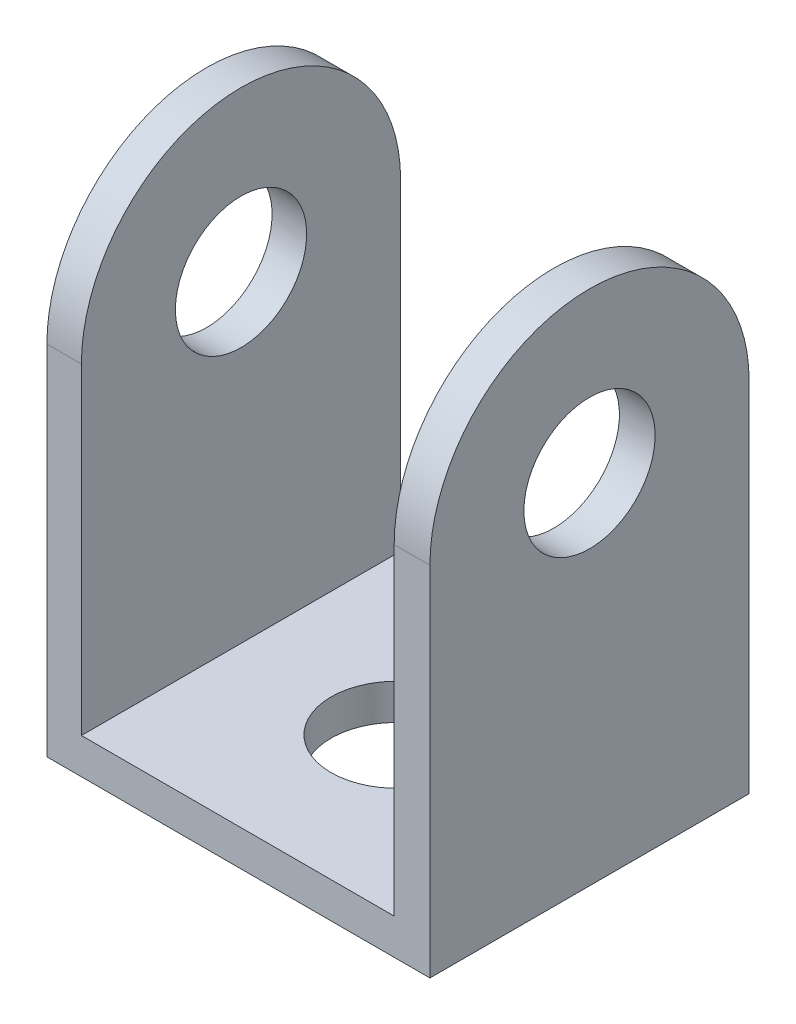
ISO-10303-21;
HEADER;
FILE_DESCRIPTION(('STEP AP214'),'2;1');
FILE_NAME('part.step','',(''),(''),'','','');
FILE_SCHEMA(('AUTOMOTIVE_DESIGN { 1 0 10303 214 1 1 1 1 }'));
ENDSEC;
DATA;
#1=APPLICATION_CONTEXT('core data for automotive mechanical design processes');
#2=APPLICATION_PROTOCOL_DEFINITION('international standard','automotive_design',2000,#1);
#3=PRODUCT_CONTEXT('',#1,'mechanical');
#4=PRODUCT('Part','Part','',(#3));
#5=PRODUCT_RELATED_PRODUCT_CATEGORY('part','',(#4));
#6=PRODUCT_DEFINITION_FORMATION('','',#4);
#7=PRODUCT_DEFINITION_CONTEXT('part definition',#1,'design');
#8=PRODUCT_DEFINITION('design','',#6,#7);
#9=PRODUCT_DEFINITION_SHAPE('','',#8);
#10=(LENGTH_UNIT() NAMED_UNIT(*) SI_UNIT(.MILLI.,.METRE.));
#11=(NAMED_UNIT(*) PLANE_ANGLE_UNIT() SI_UNIT($,.RADIAN.));
#12=(NAMED_UNIT(*) SI_UNIT($,.STERADIAN.) SOLID_ANGLE_UNIT());
#13=UNCERTAINTY_MEASURE_WITH_UNIT(LENGTH_MEASURE(1.E-05),#10,'distance_accuracy_value','');
#14=(GEOMETRIC_REPRESENTATION_CONTEXT(3) GLOBAL_UNCERTAINTY_ASSIGNED_CONTEXT((#13)) GLOBAL_UNIT_ASSIGNED_CONTEXT((#10,
#11,#12)) REPRESENTATION_CONTEXT('',''));
#15=CARTESIAN_POINT('',(0.,0.,0.));
#16=DIRECTION('',(0.,0.,1.));
#17=DIRECTION('',(1.,0.,0.));
#18=AXIS2_PLACEMENT_3D('',#15,#16,#17);
#19=CARTESIAN_POINT('',(19.05,0.,0.));
#20=DIRECTION('',(-1.,0.,0.));
#21=DIRECTION('',(0.,0.,1.));
#22=AXIS2_PLACEMENT_3D('',#19,#20,#21);
#23=CYLINDRICAL_SURFACE('',#22,7.9375);
#24=DIRECTION('',(-1.,0.,0.));
#25=VECTOR('',#24,1.);
#26=CARTESIAN_POINT('',(19.05,0.,-7.9375));
#27=LINE('',#26,#25);
#28=CARTESIAN_POINT('',(19.05,0.,-7.9375));
#29=VERTEX_POINT('',#28);
#30=CARTESIAN_POINT('',(17.272,0.,-7.9375));
#31=VERTEX_POINT('',#30);
#32=EDGE_CURVE('E50',#29,#31,#27,.T.);
#33=ORIENTED_EDGE('',*,*,#32,.T.);
#34=CARTESIAN_POINT('',(17.272,0.,0.));
#35=DIRECTION('',(1.,0.,0.));
#36=DIRECTION('',(0.,0.,-1.));
#37=AXIS2_PLACEMENT_3D('',#34,#35,#36);
#38=CIRCLE('',#37,7.9375);
#39=CARTESIAN_POINT('',(17.272,0.,7.9375));
#40=VERTEX_POINT('',#39);
#41=EDGE_CURVE('E147',#31,#40,#38,.T.);
#42=ORIENTED_EDGE('',*,*,#41,.T.);
#43=DIRECTION('',(-1.,0.,0.));
#44=VECTOR('',#43,1.);
#45=CARTESIAN_POINT('',(19.05,0.,7.9375));
#46=LINE('',#45,#44);
#47=CARTESIAN_POINT('',(19.05,0.,7.9375));
#48=VERTEX_POINT('',#47);
#49=EDGE_CURVE('E175',#48,#40,#46,.T.);
#50=ORIENTED_EDGE('',*,*,#49,.F.);
#51=CARTESIAN_POINT('',(19.05,0.,0.));
#52=DIRECTION('',(1.,0.,0.));
#53=DIRECTION('',(0.,0.,-1.));
#54=AXIS2_PLACEMENT_3D('',#51,#52,#53);
#55=CIRCLE('',#54,7.9375);
#56=EDGE_CURVE('E95',#29,#48,#55,.T.);
#57=ORIENTED_EDGE('',*,*,#56,.F.);
#58=EDGE_LOOP('',(#33,#42,#50,#57));
#59=FACE_BOUND('',#58,.T.);
#60=ADVANCED_FACE('F41',(#59),#23,.T.);
#61=CARTESIAN_POINT('',(19.05,0.,0.));
#62=DIRECTION('',(-1.,0.,0.));
#63=DIRECTION('',(0.,0.,1.));
#64=AXIS2_PLACEMENT_3D('',#61,#62,#63);
#65=CYLINDRICAL_SURFACE('',#64,3.2639);
#66=CARTESIAN_POINT('',(17.272,0.,0.));
#67=DIRECTION('',(1.,0.,0.));
#68=DIRECTION('',(0.,0.,-1.));
#69=AXIS2_PLACEMENT_3D('',#66,#67,#68);
#70=CIRCLE('',#69,3.2639);
#71=CARTESIAN_POINT('',(17.272,0.,3.2639));
#72=VERTEX_POINT('',#71);
#73=EDGE_CURVE('E137',#72,#72,#70,.T.);
#74=CARTESIAN_POINT('',(19.05,0.,0.));
#75=DIRECTION('',(1.,0.,0.));
#76=DIRECTION('',(0.,0.,-1.));
#77=AXIS2_PLACEMENT_3D('',#74,#75,#76);
#78=CIRCLE('',#77,3.2639);
#79=CARTESIAN_POINT('',(19.05,0.,3.2639));
#80=VERTEX_POINT('',#79);
#81=EDGE_CURVE('E158',#80,#80,#78,.T.);
#82=CARTESIAN_POINT('',(17.272,0.,3.2639));
#83=CARTESIAN_POINT('',(17.2905208333333,0.,3.2639));
#84=CARTESIAN_POINT('',(17.3090416666667,0.,3.2639));
#85=CARTESIAN_POINT('',(17.3460833333333,0.,3.2639));
#86=CARTESIAN_POINT('',(17.3646041666667,0.,3.2639));
#87=CARTESIAN_POINT('',(17.4016458333333,0.,3.2639));
#88=CARTESIAN_POINT('',(17.4201666666667,0.,3.2639));
#89=CARTESIAN_POINT('',(17.4572083333333,0.,3.2639));
#90=CARTESIAN_POINT('',(17.4757291666667,0.,3.2639));
#91=CARTESIAN_POINT('',(17.5127708333333,0.,3.2639));
#92=CARTESIAN_POINT('',(17.5312916666667,0.,3.2639));
#93=CARTESIAN_POINT('',(17.5683333333333,0.,3.2639));
#94=CARTESIAN_POINT('',(17.5868541666667,0.,3.2639));
#95=CARTESIAN_POINT('',(17.6238958333333,0.,3.2639));
#96=CARTESIAN_POINT('',(17.6424166666667,0.,3.2639));
#97=CARTESIAN_POINT('',(17.6794583333333,0.,3.2639));
#98=CARTESIAN_POINT('',(17.6979791666667,0.,3.2639));
#99=CARTESIAN_POINT('',(17.7350208333333,0.,3.2639));
#100=CARTESIAN_POINT('',(17.7535416666667,0.,3.2639));
#101=CARTESIAN_POINT('',(17.7905833333333,0.,3.2639));
#102=CARTESIAN_POINT('',(17.8091041666667,0.,3.2639));
#103=CARTESIAN_POINT('',(17.8461458333333,0.,3.2639));
#104=CARTESIAN_POINT('',(17.8646666666667,0.,3.2639));
#105=CARTESIAN_POINT('',(17.9017083333333,0.,3.2639));
#106=CARTESIAN_POINT('',(17.9202291666667,0.,3.2639));
#107=CARTESIAN_POINT('',(17.9572708333333,0.,3.2639));
#108=CARTESIAN_POINT('',(17.9757916666667,0.,3.2639));
#109=CARTESIAN_POINT('',(18.0128333333333,0.,3.2639));
#110=CARTESIAN_POINT('',(18.0313541666667,0.,3.2639));
#111=CARTESIAN_POINT('',(18.0683958333333,0.,3.2639));
#112=CARTESIAN_POINT('',(18.0869166666667,0.,3.2639));
#113=CARTESIAN_POINT('',(18.1239583333333,0.,3.2639));
#114=CARTESIAN_POINT('',(18.1424791666667,0.,3.2639));
#115=CARTESIAN_POINT('',(18.1795208333333,0.,3.2639));
#116=CARTESIAN_POINT('',(18.1980416666667,0.,3.2639));
#117=CARTESIAN_POINT('',(18.2350833333333,0.,3.2639));
#118=CARTESIAN_POINT('',(18.2536041666667,0.,3.2639));
#119=CARTESIAN_POINT('',(18.2906458333333,0.,3.2639));
#120=CARTESIAN_POINT('',(18.3091666666667,0.,3.2639));
#121=CARTESIAN_POINT('',(18.3462083333333,0.,3.2639));
#122=CARTESIAN_POINT('',(18.3647291666667,0.,3.2639));
#123=CARTESIAN_POINT('',(18.4017708333333,0.,3.2639));
#124=CARTESIAN_POINT('',(18.4202916666667,0.,3.2639));
#125=CARTESIAN_POINT('',(18.4573333333333,0.,3.2639));
#126=CARTESIAN_POINT('',(18.4758541666667,0.,3.2639));
#127=CARTESIAN_POINT('',(18.5128958333333,0.,3.2639));
#128=CARTESIAN_POINT('',(18.5314166666667,0.,3.2639));
#129=CARTESIAN_POINT('',(18.5684583333333,0.,3.2639));
#130=CARTESIAN_POINT('',(18.5869791666667,0.,3.2639));
#131=CARTESIAN_POINT('',(18.6240208333333,0.,3.2639));
#132=CARTESIAN_POINT('',(18.6425416666667,0.,3.2639));
#133=CARTESIAN_POINT('',(18.6795833333333,0.,3.2639));
#134=CARTESIAN_POINT('',(18.6981041666667,0.,3.2639));
#135=CARTESIAN_POINT('',(18.7351458333333,0.,3.2639));
#136=CARTESIAN_POINT('',(18.7536666666667,0.,3.2639));
#137=CARTESIAN_POINT('',(18.7907083333333,0.,3.2639));
#138=CARTESIAN_POINT('',(18.8092291666667,0.,3.2639));
#139=CARTESIAN_POINT('',(18.8462708333333,0.,3.2639));
#140=CARTESIAN_POINT('',(18.8647916666667,0.,3.2639));
#141=CARTESIAN_POINT('',(18.9018333333333,0.,3.2639));
#142=CARTESIAN_POINT('',(18.9203541666667,0.,3.2639));
#143=CARTESIAN_POINT('',(18.9573958333333,0.,3.2639));
#144=CARTESIAN_POINT('',(18.9759166666667,0.,3.2639));
#145=CARTESIAN_POINT('',(19.0129583333333,0.,3.2639));
#146=CARTESIAN_POINT('',(19.0314791666667,0.,3.2639));
#147=CARTESIAN_POINT('',(19.05,0.,3.2639));
#148=B_SPLINE_CURVE_WITH_KNOTS('',3,(#82,#83,#84,#85,#86,#87,#88,#89,#90,#91,#92,#93,#94,#95,
#96,#97,#98,#99,#100,#101,#102,#103,#104,#105,#106,#107,#108,#109,#110,#111,#112,#113,#114,#115,
#116,#117,#118,#119,#120,#121,#122,#123,#124,#125,#126,#127,#128,#129,#130,#131,#132,#133,#134,
#135,#136,#137,#138,#139,#140,#141,#142,#143,#144,#145,#146,#147),.UNSPECIFIED.,.F.,.F.,(4,2,2,
2,2,2,2,2,2,2,2,2,2,2,2,2,2,2,2,2,2,2,2,2,2,2,2,2,2,2,2,2,4),(0.,0.0555625000000018,0.111125,
0.166687500000002,0.22225,0.277812500000002,0.333375,0.388937500000002,0.4445,0.500062500000002,
0.555625000000001,0.611187500000002,0.666750000000001,0.722312500000002,0.777875000000001,
0.833437500000003,0.889000000000001,0.944562499999999,1.000125,1.0556875,1.11125,1.1668125,
1.222375,1.2779375,1.3335,1.3890625,1.444625,1.5001875,1.55575,1.6113125,1.666875,1.7224375,
1.778),.UNSPECIFIED.);
#149=EDGE_CURVE('BSEAM206',#72,#80,#148,.T.);
#150=ORIENTED_EDGE('',*,*,#73,.F.);
#151=ORIENTED_EDGE('',*,*,#81,.T.);
#152=ORIENTED_EDGE('',*,*,#149,.T.);
#153=ORIENTED_EDGE('',*,*,#149,.F.);
#154=EDGE_LOOP('',(#150,#152,#151,#153));
#155=FACE_BOUND('',#154,.T.);
#156=ADVANCED_FACE('F206',(#155),#65,.F.);
#157=CARTESIAN_POINT('',(19.05,0.,-7.9375));
#158=DIRECTION('',(0.,0.,1.));
#159=DIRECTION('',(0.,-1.,0.));
#160=AXIS2_PLACEMENT_3D('',#157,#158,#159);
#161=PLANE('',#160);
#162=DIRECTION('',(1.,0.,0.));
#163=VECTOR('',#162,1.);
#164=CARTESIAN_POINT('',(19.05,-16.002,-7.9375));
#165=LINE('',#164,#163);
#166=CARTESIAN_POINT('',(1.71697331779427,-16.002,-7.9375));
#167=VERTEX_POINT('',#166);
#168=CARTESIAN_POINT('',(17.272,-16.002,-7.9375));
#169=VERTEX_POINT('',#168);
#170=EDGE_CURVE('E118',#167,#169,#165,.T.);
#171=ORIENTED_EDGE('',*,*,#170,.T.);
#172=DIRECTION('',(0.,1.,0.));
#173=VECTOR('',#172,1.);
#174=CARTESIAN_POINT('',(17.272,0.,-7.9375));
#175=LINE('',#174,#173);
#176=EDGE_CURVE('E128',#169,#31,#175,.T.);
#177=ORIENTED_EDGE('',*,*,#176,.T.);
#178=ORIENTED_EDGE('',*,*,#32,.F.);
#179=DIRECTION('',(0.,1.,0.));
#180=VECTOR('',#179,1.);
#181=CARTESIAN_POINT('',(19.05,0.,-7.9375));
#182=LINE('',#181,#180);
#183=CARTESIAN_POINT('',(19.05,-17.78,-7.9375));
#184=VERTEX_POINT('',#183);
#185=EDGE_CURVE('E151',#184,#29,#182,.T.);
#186=ORIENTED_EDGE('',*,*,#185,.F.);
#187=DIRECTION('',(-1.,0.,0.));
#188=VECTOR('',#187,1.);
#189=CARTESIAN_POINT('',(19.05,-17.78,-7.9375));
#190=LINE('',#189,#188);
#191=CARTESIAN_POINT('',(0.,-17.78,-7.9375));
#192=VERTEX_POINT('',#191);
#193=EDGE_CURVE('E161',#184,#192,#190,.T.);
#194=ORIENTED_EDGE('',*,*,#193,.T.);
#195=DIRECTION('',(0.,1.,0.));
#196=VECTOR('',#195,1.);
#197=CARTESIAN_POINT('',(0.,0.,-7.9375));
#198=LINE('',#197,#196);
#199=CARTESIAN_POINT('',(0.,0.,-7.9375));
#200=VERTEX_POINT('',#199);
#201=EDGE_CURVE('E127',#192,#200,#198,.T.);
#202=ORIENTED_EDGE('',*,*,#201,.T.);
#203=CARTESIAN_POINT('',(1.71697331779427,0.,-7.9375));
#204=VERTEX_POINT('',#203);
#205=EDGE_CURVE('E136',#204,#200,#27,.T.);
#206=ORIENTED_EDGE('',*,*,#205,.F.);
#207=DIRECTION('',(0.,-1.,0.));
#208=VECTOR('',#207,1.);
#209=CARTESIAN_POINT('',(1.71697331779427,0.,-7.9375));
#210=LINE('',#209,#208);
#211=EDGE_CURVE('E131',#204,#167,#210,.T.);
#212=ORIENTED_EDGE('',*,*,#211,.T.);
#213=EDGE_LOOP('',(#171,#177,#178,#186,#194,#202,#206,#212));
#214=FACE_BOUND('',#213,.T.);
#215=ADVANCED_FACE('F43',(#214),#161,.F.);
#216=CARTESIAN_POINT('',(1.71697331779427,0.,7.9375));
#217=VERTEX_POINT('',#216);
#218=CARTESIAN_POINT('',(0.,0.,7.9375));
#219=VERTEX_POINT('',#218);
#220=EDGE_CURVE('E174',#217,#219,#46,.T.);
#221=ORIENTED_EDGE('',*,*,#220,.F.);
#222=CARTESIAN_POINT('',(1.71697331779427,0.,0.));
#223=DIRECTION('',(-1.,0.,0.));
#224=DIRECTION('',(0.,0.,1.));
#225=AXIS2_PLACEMENT_3D('',#222,#223,#224);
#226=CIRCLE('',#225,7.9375);
#227=EDGE_CURVE('E57',#217,#204,#226,.T.);
#228=ORIENTED_EDGE('',*,*,#227,.T.);
#229=ORIENTED_EDGE('',*,*,#205,.T.);
#230=CARTESIAN_POINT('',(0.,0.,0.));
#231=DIRECTION('',(1.,0.,0.));
#232=DIRECTION('',(0.,0.,-1.));
#233=AXIS2_PLACEMENT_3D('',#230,#231,#232);
#234=CIRCLE('',#233,7.9375);
#235=EDGE_CURVE('E163',#200,#219,#234,.T.);
#236=ORIENTED_EDGE('',*,*,#235,.T.);
#237=EDGE_LOOP('',(#221,#228,#229,#236));
#238=FACE_BOUND('',#237,.T.);
#239=ADVANCED_FACE('F207',(#238),#23,.T.);
#240=CARTESIAN_POINT('',(19.05,0.,7.9375));
#241=DIRECTION('',(0.,0.,-1.));
#242=DIRECTION('',(0.,1.,0.));
#243=AXIS2_PLACEMENT_3D('',#240,#241,#242);
#244=PLANE('',#243);
#245=ORIENTED_EDGE('',*,*,#49,.T.);
#246=DIRECTION('',(0.,-1.,0.));
#247=VECTOR('',#246,1.);
#248=CARTESIAN_POINT('',(17.272,0.,7.9375));
#249=LINE('',#248,#247);
#250=CARTESIAN_POINT('',(17.272,-16.002,7.9375));
#251=VERTEX_POINT('',#250);
#252=EDGE_CURVE('E140',#40,#251,#249,.T.);
#253=ORIENTED_EDGE('',*,*,#252,.T.);
#254=DIRECTION('',(-1.,0.,0.));
#255=VECTOR('',#254,1.);
#256=CARTESIAN_POINT('',(19.05,-16.002,7.9375));
#257=LINE('',#256,#255);
#258=CARTESIAN_POINT('',(1.71697331779427,-16.002,7.9375));
#259=VERTEX_POINT('',#258);
#260=EDGE_CURVE('E11',#251,#259,#257,.T.);
#261=ORIENTED_EDGE('',*,*,#260,.T.);
#262=DIRECTION('',(0.,1.,0.));
#263=VECTOR('',#262,1.);
#264=CARTESIAN_POINT('',(1.71697331779427,0.,7.9375));
#265=LINE('',#264,#263);
#266=EDGE_CURVE('E132',#259,#217,#265,.T.);
#267=ORIENTED_EDGE('',*,*,#266,.T.);
#268=ORIENTED_EDGE('',*,*,#220,.T.);
#269=DIRECTION('',(0.,-1.,0.));
#270=VECTOR('',#269,1.);
#271=CARTESIAN_POINT('',(0.,0.,7.9375));
#272=LINE('',#271,#270);
#273=CARTESIAN_POINT('',(0.,-17.78,7.9375));
#274=VERTEX_POINT('',#273);
#275=EDGE_CURVE('E166',#219,#274,#272,.T.);
#276=ORIENTED_EDGE('',*,*,#275,.T.);
#277=DIRECTION('',(-1.,0.,0.));
#278=VECTOR('',#277,1.);
#279=CARTESIAN_POINT('',(19.05,-17.78,7.9375));
#280=LINE('',#279,#278);
#281=CARTESIAN_POINT('',(19.05,-17.78,7.9375));
#282=VERTEX_POINT('',#281);
#283=EDGE_CURVE('E172',#282,#274,#280,.T.);
#284=ORIENTED_EDGE('',*,*,#283,.F.);
#285=DIRECTION('',(0.,-1.,0.));
#286=VECTOR('',#285,1.);
#287=CARTESIAN_POINT('',(19.05,0.,7.9375));
#288=LINE('',#287,#286);
#289=EDGE_CURVE('E155',#48,#282,#288,.T.);
#290=ORIENTED_EDGE('',*,*,#289,.F.);
#291=EDGE_LOOP('',(#245,#253,#261,#267,#268,#276,#284,#290));
#292=FACE_BOUND('',#291,.T.);
#293=ADVANCED_FACE('F217',(#292),#244,.F.);
#294=CARTESIAN_POINT('',(19.05,-17.78,0.));
#295=DIRECTION('',(0.,1.,0.));
#296=DIRECTION('',(0.,0.,1.));
#297=AXIS2_PLACEMENT_3D('',#294,#295,#296);
#298=PLANE('',#297);
#299=CARTESIAN_POINT('',(9.525,-17.78,0.0634999999999993));
#300=DIRECTION('',(0.,1.,0.));
#301=DIRECTION('',(0.,0.,1.));
#302=AXIS2_PLACEMENT_3D('',#299,#300,#301);
#303=CIRCLE('',#302,3.2639);
#304=CARTESIAN_POINT('',(9.525,-17.78,3.3274));
#305=VERTEX_POINT('',#304);
#306=EDGE_CURVE('E186',#305,#305,#303,.T.);
#307=ORIENTED_EDGE('',*,*,#306,.T.);
#308=EDGE_LOOP('',(#307));
#309=FACE_BOUND('',#308,.T.);
#310=DIRECTION('',(0.,0.,-1.));
#311=VECTOR('',#310,1.);
#312=CARTESIAN_POINT('',(0.,-17.78,0.));
#313=LINE('',#312,#311);
#314=EDGE_CURVE('E87',#274,#192,#313,.T.);
#315=ORIENTED_EDGE('',*,*,#314,.T.);
#316=ORIENTED_EDGE('',*,*,#193,.F.);
#317=DIRECTION('',(0.,0.,-1.));
#318=VECTOR('',#317,1.);
#319=CARTESIAN_POINT('',(19.05,-17.78,0.));
#320=LINE('',#319,#318);
#321=EDGE_CURVE('E66',#282,#184,#320,.T.);
#322=ORIENTED_EDGE('',*,*,#321,.F.);
#323=ORIENTED_EDGE('',*,*,#283,.T.);
#324=EDGE_LOOP('',(#315,#316,#322,#323));
#325=FACE_BOUND('',#324,.T.);
#326=ADVANCED_FACE('F223',(#309,#325),#298,.F.);
#327=CARTESIAN_POINT('',(1.71697331779427,0.,0.));
#328=DIRECTION('',(-1.,0.,0.));
#329=DIRECTION('',(0.,0.,1.));
#330=AXIS2_PLACEMENT_3D('',#327,#328,#329);
#331=CIRCLE('',#330,3.2639);
#332=CARTESIAN_POINT('',(1.71697331779427,0.,3.2639));
#333=VERTEX_POINT('',#332);
#334=EDGE_CURVE('E179',#333,#333,#331,.T.);
#335=CARTESIAN_POINT('',(0.,0.,0.));
#336=DIRECTION('',(1.,0.,0.));
#337=DIRECTION('',(0.,0.,-1.));
#338=AXIS2_PLACEMENT_3D('',#335,#336,#337);
#339=CIRCLE('',#338,3.2639);
#340=CARTESIAN_POINT('',(0.,0.,3.2639));
#341=VERTEX_POINT('',#340);
#342=EDGE_CURVE('E153',#341,#341,#339,.T.);
#343=CARTESIAN_POINT('',(1.71697331779427,0.,3.2639));
#344=CARTESIAN_POINT('',(1.69908817906724,0.,3.2639));
#345=CARTESIAN_POINT('',(1.68120304034022,0.,3.2639));
#346=CARTESIAN_POINT('',(1.64543276288617,0.,3.2639));
#347=CARTESIAN_POINT('',(1.62754762415915,0.,3.2639));
#348=CARTESIAN_POINT('',(1.5917773467051,0.,3.2639));
#349=CARTESIAN_POINT('',(1.57389220797808,0.,3.2639));
#350=CARTESIAN_POINT('',(1.53812193052403,0.,3.2639));
#351=CARTESIAN_POINT('',(1.52023679179701,0.,3.2639));
#352=CARTESIAN_POINT('',(1.48446651434296,0.,3.2639));
#353=CARTESIAN_POINT('',(1.46658137561594,0.,3.2639));
#354=CARTESIAN_POINT('',(1.43081109816189,0.,3.2639));
#355=CARTESIAN_POINT('',(1.41292595943487,0.,3.2639));
#356=CARTESIAN_POINT('',(1.37715568198082,0.,3.2639));
#357=CARTESIAN_POINT('',(1.35927054325379,0.,3.2639));
#358=CARTESIAN_POINT('',(1.32350026579975,0.,3.2639));
#359=CARTESIAN_POINT('',(1.30561512707272,0.,3.2639));
#360=CARTESIAN_POINT('',(1.26984484961868,0.,3.2639));
#361=CARTESIAN_POINT('',(1.25195971089165,0.,3.2639));
#362=CARTESIAN_POINT('',(1.21618943343761,0.,3.2639));
#363=CARTESIAN_POINT('',(1.19830429471058,0.,3.2639));
#364=CARTESIAN_POINT('',(1.16253401725653,0.,3.2639));
#365=CARTESIAN_POINT('',(1.14464887852951,0.,3.2639));
#366=CARTESIAN_POINT('',(1.10887860107546,0.,3.2639));
#367=CARTESIAN_POINT('',(1.09099346234844,0.,3.2639));
#368=CARTESIAN_POINT('',(1.05522318489439,0.,3.2639));
#369=CARTESIAN_POINT('',(1.03733804616737,0.,3.2639));
#370=CARTESIAN_POINT('',(1.00156776871332,0.,3.2639));
#371=CARTESIAN_POINT('',(0.983682629986298,0.,3.2639));
#372=CARTESIAN_POINT('',(0.947912352532251,0.,3.2639));
#373=CARTESIAN_POINT('',(0.930027213805228,0.,3.2639));
#374=CARTESIAN_POINT('',(0.894256936351181,0.,3.2639));
#375=CARTESIAN_POINT('',(0.876371797624157,0.,3.2639));
#376=CARTESIAN_POINT('',(0.840601520170109,0.,3.2639));
#377=CARTESIAN_POINT('',(0.822716381443085,0.,3.2639));
#378=CARTESIAN_POINT('',(0.786946103989039,0.,3.2639));
#379=CARTESIAN_POINT('',(0.769060965262016,0.,3.2639));
#380=CARTESIAN_POINT('',(0.733290687807969,0.,3.2639));
#381=CARTESIAN_POINT('',(0.715405549080945,0.,3.2639));
#382=CARTESIAN_POINT('',(0.679635271626897,0.,3.2639));
#383=CARTESIAN_POINT('',(0.661750132899873,0.,3.2639));
#384=CARTESIAN_POINT('',(0.625979855445826,0.,3.2639));
#385=CARTESIAN_POINT('',(0.608094716718804,0.,3.2639));
#386=CARTESIAN_POINT('',(0.572324439264757,0.,3.2639));
#387=CARTESIAN_POINT('',(0.554439300537733,0.,3.2639));
#388=CARTESIAN_POINT('',(0.518669023083685,0.,3.2639));
#389=CARTESIAN_POINT('',(0.500783884356661,0.,3.2639));
#390=CARTESIAN_POINT('',(0.465013606902614,0.,3.2639));
#391=CARTESIAN_POINT('',(0.447128468175591,0.,3.2639));
#392=CARTESIAN_POINT('',(0.411358190721544,0.,3.2639));
#393=CARTESIAN_POINT('',(0.39347305199452,0.,3.2639));
#394=CARTESIAN_POINT('',(0.357702774540473,0.,3.2639));
#395=CARTESIAN_POINT('',(0.339817635813449,0.,3.2639));
#396=CARTESIAN_POINT('',(0.304047358359401,0.,3.2639));
#397=CARTESIAN_POINT('',(0.286162219632377,0.,3.2639));
#398=CARTESIAN_POINT('',(0.25039194217833,0.,3.2639));
#399=CARTESIAN_POINT('',(0.232506803451307,0.,3.2639));
#400=CARTESIAN_POINT('',(0.19673652599726,0.,3.2639));
#401=CARTESIAN_POINT('',(0.178851387270236,0.,3.2639));
#402=CARTESIAN_POINT('',(0.143081109816188,0.,3.2639));
#403=CARTESIAN_POINT('',(0.125195971089164,0.,3.2639));
#404=CARTESIAN_POINT('',(0.0894256936351176,0.,3.2639));
#405=CARTESIAN_POINT('',(0.0715405549080947,0.,3.2639));
#406=CARTESIAN_POINT('',(0.0357702774540479,0.,3.2639));
#407=CARTESIAN_POINT('',(0.017885138727024,0.,3.2639));
#408=CARTESIAN_POINT('',(0.,0.,3.2639));
#409=B_SPLINE_CURVE_WITH_KNOTS('',3,(#343,#344,#345,#346,#347,#348,#349,#350,#351,#352,#353,
#354,#355,#356,#357,#358,#359,#360,#361,#362,#363,#364,#365,#366,#367,#368,#369,#370,#371,#372,
#373,#374,#375,#376,#377,#378,#379,#380,#381,#382,#383,#384,#385,#386,#387,#388,#389,#390,#391,
#392,#393,#394,#395,#396,#397,#398,#399,#400,#401,#402,#403,#404,#405,#406,#407,#408),
.UNSPECIFIED.,.F.,.F.,(4,2,2,2,2,2,2,2,2,2,2,2,2,2,2,2,2,2,2,2,2,2,2,2,2,2,2,2,2,2,2,2,4),(0.,
0.0536554161810719,0.10731083236214,0.160966248543212,0.214621664724284,0.268277080905353,
0.321932497086425,0.375587913267497,0.429243329448568,0.482898745629637,0.536554161810709,
0.590209577991781,0.643864994172849,0.697520410353921,0.751175826534993,0.804831242716061,
0.858486658897133,0.912142075078205,0.965797491259274,1.01945290744035,1.07310832362142,
1.12676373980249,1.18041915598356,1.23407457216463,1.2877299883457,1.34138540452677,
1.39504082070784,1.44869623688891,1.50235165306998,1.55600706925105,1.60966248543213,
1.66331790161319,1.71697331779427),.UNSPECIFIED.);
#410=EDGE_CURVE('BSEAM214',#333,#341,#409,.T.);
#411=ORIENTED_EDGE('',*,*,#334,.F.);
#412=ORIENTED_EDGE('',*,*,#342,.F.);
#413=ORIENTED_EDGE('',*,*,#410,.T.);
#414=ORIENTED_EDGE('',*,*,#410,.F.);
#415=EDGE_LOOP('',(#411,#413,#412,#414));
#416=FACE_BOUND('',#415,.T.);
#417=ADVANCED_FACE('F214',(#416),#65,.F.);
#418=CARTESIAN_POINT('',(19.05,0.,0.));
#419=DIRECTION('',(1.,0.,0.));
#420=DIRECTION('',(0.,0.,-1.));
#421=AXIS2_PLACEMENT_3D('',#418,#419,#420);
#422=PLANE('',#421);
#423=ORIENTED_EDGE('',*,*,#185,.T.);
#424=ORIENTED_EDGE('',*,*,#56,.T.);
#425=ORIENTED_EDGE('',*,*,#289,.T.);
#426=ORIENTED_EDGE('',*,*,#321,.T.);
#427=EDGE_LOOP('',(#423,#424,#425,#426));
#428=FACE_BOUND('',#427,.T.);
#429=ORIENTED_EDGE('',*,*,#81,.F.);
#430=EDGE_LOOP('',(#429));
#431=FACE_BOUND('',#430,.T.);
#432=ADVANCED_FACE('F233',(#428,#431),#422,.T.);
#433=CARTESIAN_POINT('',(0.,0.,0.));
#434=DIRECTION('',(1.,0.,0.));
#435=DIRECTION('',(0.,0.,-1.));
#436=AXIS2_PLACEMENT_3D('',#433,#434,#435);
#437=PLANE('',#436);
#438=ORIENTED_EDGE('',*,*,#201,.F.);
#439=ORIENTED_EDGE('',*,*,#314,.F.);
#440=ORIENTED_EDGE('',*,*,#275,.F.);
#441=ORIENTED_EDGE('',*,*,#235,.F.);
#442=EDGE_LOOP('',(#438,#439,#440,#441));
#443=FACE_BOUND('',#442,.T.);
#444=ORIENTED_EDGE('',*,*,#342,.T.);
#445=EDGE_LOOP('',(#444));
#446=FACE_BOUND('',#445,.T.);
#447=ADVANCED_FACE('F242',(#443,#446),#437,.F.);
#448=CARTESIAN_POINT('',(1.71697331779427,-16.002,-12.7));
#449=DIRECTION('',(0.,-1.,0.));
#450=DIRECTION('',(0.,0.,-1.));
#451=AXIS2_PLACEMENT_3D('',#448,#449,#450);
#452=PLANE('',#451);
#453=CARTESIAN_POINT('',(9.525,-16.002,0.0634999999999993));
#454=DIRECTION('',(0.,-1.,0.));
#455=DIRECTION('',(0.,0.,-1.));
#456=AXIS2_PLACEMENT_3D('',#453,#454,#455);
#457=CIRCLE('',#456,3.2639);
#458=CARTESIAN_POINT('',(9.525,-16.002,-3.2004));
#459=VERTEX_POINT('',#458);
#460=EDGE_CURVE('E45',#459,#459,#457,.T.);
#461=ORIENTED_EDGE('',*,*,#460,.T.);
#462=EDGE_LOOP('',(#461));
#463=FACE_BOUND('',#462,.T.);
#464=DIRECTION('',(0.,0.,1.));
#465=VECTOR('',#464,1.);
#466=CARTESIAN_POINT('',(1.71697331779427,-16.002,-12.7));
#467=LINE('',#466,#465);
#468=EDGE_CURVE('E121',#167,#259,#467,.T.);
#469=ORIENTED_EDGE('',*,*,#468,.T.);
#470=ORIENTED_EDGE('',*,*,#260,.F.);
#471=DIRECTION('',(0.,0.,1.));
#472=VECTOR('',#471,1.);
#473=CARTESIAN_POINT('',(17.272,-16.002,-12.7));
#474=LINE('',#473,#472);
#475=EDGE_CURVE('E123',#169,#251,#474,.T.);
#476=ORIENTED_EDGE('',*,*,#475,.F.);
#477=ORIENTED_EDGE('',*,*,#170,.F.);
#478=EDGE_LOOP('',(#469,#470,#476,#477));
#479=FACE_BOUND('',#478,.T.);
#480=ADVANCED_FACE('F120',(#463,#479),#452,.F.);
#481=CARTESIAN_POINT('',(17.272,-16.002,-12.7));
#482=DIRECTION('',(1.,0.,0.));
#483=DIRECTION('',(0.,0.,-1.));
#484=AXIS2_PLACEMENT_3D('',#481,#482,#483);
#485=PLANE('',#484);
#486=ORIENTED_EDGE('',*,*,#73,.T.);
#487=EDGE_LOOP('',(#486));
#488=FACE_BOUND('',#487,.T.);
#489=ORIENTED_EDGE('',*,*,#475,.T.);
#490=ORIENTED_EDGE('',*,*,#252,.F.);
#491=ORIENTED_EDGE('',*,*,#41,.F.);
#492=ORIENTED_EDGE('',*,*,#176,.F.);
#493=EDGE_LOOP('',(#489,#490,#491,#492));
#494=FACE_BOUND('',#493,.T.);
#495=ADVANCED_FACE('F202',(#488,#494),#485,.F.);
#496=CARTESIAN_POINT('',(1.71697331779427,-16.002,-12.7));
#497=DIRECTION('',(-1.,0.,0.));
#498=DIRECTION('',(0.,0.,1.));
#499=AXIS2_PLACEMENT_3D('',#496,#497,#498);
#500=PLANE('',#499);
#501=ORIENTED_EDGE('',*,*,#334,.T.);
#502=EDGE_LOOP('',(#501));
#503=FACE_BOUND('',#502,.T.);
#504=ORIENTED_EDGE('',*,*,#227,.F.);
#505=ORIENTED_EDGE('',*,*,#266,.F.);
#506=ORIENTED_EDGE('',*,*,#468,.F.);
#507=ORIENTED_EDGE('',*,*,#211,.F.);
#508=EDGE_LOOP('',(#504,#505,#506,#507));
#509=FACE_BOUND('',#508,.T.);
#510=ADVANCED_FACE('F130',(#503,#509),#500,.F.);
#511=CARTESIAN_POINT('',(9.525,-17.78,0.0634999999999993));
#512=DIRECTION('',(0.,1.,0.));
#513=DIRECTION('',(0.,0.,1.));
#514=AXIS2_PLACEMENT_3D('',#511,#512,#513);
#515=CYLINDRICAL_SURFACE('',#514,3.2639);
#516=ORIENTED_EDGE('',*,*,#306,.F.);
#517=EDGE_LOOP('',(#516));
#518=FACE_BOUND('',#517,.T.);
#519=ORIENTED_EDGE('',*,*,#460,.F.);
#520=EDGE_LOOP('',(#519));
#521=FACE_BOUND('',#520,.T.);
#522=ADVANCED_FACE('F194',(#518,#521),#515,.F.);
#523=CLOSED_SHELL('',(#60,#156,#215,#239,#293,#326,#417,#432,#447,#480,#495,#510,#522));
#524=MANIFOLD_SOLID_BREP('B2',#523);
#525=ADVANCED_BREP_SHAPE_REPRESENTATION('',(#18,#524),#14);
#526=SHAPE_DEFINITION_REPRESENTATION(#9,#525);
ENDSEC;
END-ISO-10303-21;
